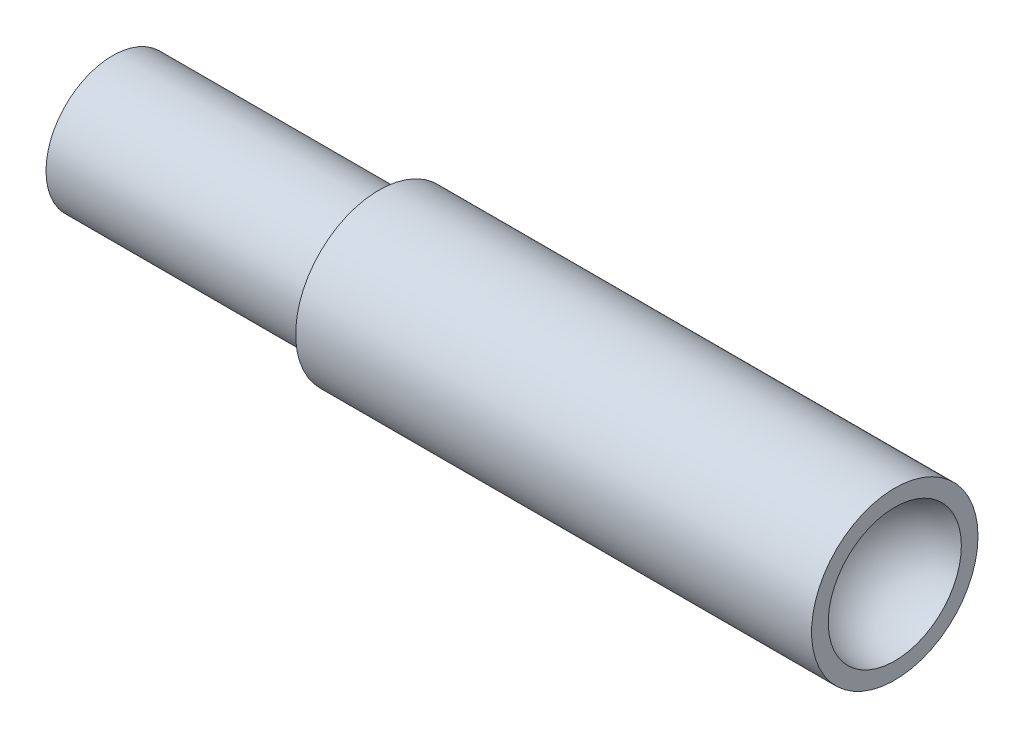
ISO-10303-21;
HEADER;
FILE_DESCRIPTION(('STEP AP214'),'2;1');
FILE_NAME('part.step','',(''),(''),'','','');
FILE_SCHEMA(('AUTOMOTIVE_DESIGN { 1 0 10303 214 1 1 1 1 }'));
ENDSEC;
DATA;
#1=APPLICATION_CONTEXT('core data for automotive mechanical design processes');
#2=APPLICATION_PROTOCOL_DEFINITION('international standard','automotive_design',2000,#1);
#3=PRODUCT_CONTEXT('',#1,'mechanical');
#4=PRODUCT('Part','Part','',(#3));
#5=PRODUCT_RELATED_PRODUCT_CATEGORY('part','',(#4));
#6=PRODUCT_DEFINITION_FORMATION('','',#4);
#7=PRODUCT_DEFINITION_CONTEXT('part definition',#1,'design');
#8=PRODUCT_DEFINITION('design','',#6,#7);
#9=PRODUCT_DEFINITION_SHAPE('','',#8);
#10=(LENGTH_UNIT() NAMED_UNIT(*) SI_UNIT(.MILLI.,.METRE.));
#11=(NAMED_UNIT(*) PLANE_ANGLE_UNIT() SI_UNIT($,.RADIAN.));
#12=(NAMED_UNIT(*) SI_UNIT($,.STERADIAN.) SOLID_ANGLE_UNIT());
#13=UNCERTAINTY_MEASURE_WITH_UNIT(LENGTH_MEASURE(1.E-05),#10,'distance_accuracy_value','');
#14=(GEOMETRIC_REPRESENTATION_CONTEXT(3) GLOBAL_UNCERTAINTY_ASSIGNED_CONTEXT((#13)) GLOBAL_UNIT_ASSIGNED_CONTEXT((#10,
#11,#12)) REPRESENTATION_CONTEXT('',''));
#15=CARTESIAN_POINT('',(0.,0.,0.));
#16=DIRECTION('',(0.,0.,1.));
#17=DIRECTION('',(1.,0.,0.));
#18=AXIS2_PLACEMENT_3D('',#15,#16,#17);
#19=CARTESIAN_POINT('',(-80.,0.,0.));
#20=DIRECTION('',(1.,0.,0.));
#21=DIRECTION('',(0.,0.,-1.));
#22=AXIS2_PLACEMENT_3D('',#19,#20,#21);
#23=CYLINDRICAL_SURFACE('',#22,20.);
#24=CARTESIAN_POINT('',(-80.,0.,0.));
#25=DIRECTION('',(-1.,0.,0.));
#26=DIRECTION('',(0.,0.,1.));
#27=AXIS2_PLACEMENT_3D('',#24,#25,#26);
#28=CIRCLE('',#27,20.);
#29=CARTESIAN_POINT('',(-80.,0.,20.));
#30=VERTEX_POINT('',#29);
#31=EDGE_CURVE('E11',#30,#30,#28,.T.);
#32=ORIENTED_EDGE('',*,*,#31,.F.);
#33=EDGE_LOOP('',(#32));
#34=FACE_BOUND('',#33,.T.);
#35=CARTESIAN_POINT('',(0.,0.,0.));
#36=DIRECTION('',(-1.,0.,0.));
#37=DIRECTION('',(0.,0.,1.));
#38=AXIS2_PLACEMENT_3D('',#35,#36,#37);
#39=CIRCLE('',#38,20.);
#40=CARTESIAN_POINT('',(0.,0.,20.));
#41=VERTEX_POINT('',#40);
#42=EDGE_CURVE('E44',#41,#41,#39,.T.);
#43=ORIENTED_EDGE('',*,*,#42,.T.);
#44=EDGE_LOOP('',(#43));
#45=FACE_BOUND('',#44,.T.);
#46=ADVANCED_FACE('F41',(#34,#45),#23,.T.);
#47=CARTESIAN_POINT('',(-80.,0.,0.));
#48=DIRECTION('',(-1.,0.,0.));
#49=DIRECTION('',(0.,0.,1.));
#50=AXIS2_PLACEMENT_3D('',#47,#48,#49);
#51=PLANE('',#50);
#52=ORIENTED_EDGE('',*,*,#31,.T.);
#53=EDGE_LOOP('',(#52));
#54=FACE_BOUND('',#53,.T.);
#55=ADVANCED_FACE('F56',(#54),#51,.T.);
#56=CARTESIAN_POINT('',(0.,0.,0.));
#57=DIRECTION('',(-1.,0.,0.));
#58=DIRECTION('',(0.,0.,1.));
#59=AXIS2_PLACEMENT_3D('',#56,#57,#58);
#60=PLANE('',#59);
#61=ORIENTED_EDGE('',*,*,#42,.F.);
#62=EDGE_LOOP('',(#61));
#63=FACE_BOUND('',#62,.T.);
#64=ADVANCED_FACE('F54',(#63),#60,.F.);
#65=CLOSED_SHELL('',(#46,#55,#64));
#66=MANIFOLD_SOLID_BREP('B2',#65);
#67=CARTESIAN_POINT('',(155.,0.,0.));
#68=DIRECTION('',(-1.,0.,0.));
#69=DIRECTION('',(0.,0.,1.));
#70=AXIS2_PLACEMENT_3D('',#67,#68,#69);
#71=CYLINDRICAL_SURFACE('',#70,25.);
#72=CARTESIAN_POINT('',(155.,0.,0.));
#73=DIRECTION('',(1.,0.,0.));
#74=DIRECTION('',(0.,0.,-1.));
#75=AXIS2_PLACEMENT_3D('',#72,#73,#74);
#76=CIRCLE('',#75,25.);
#77=CARTESIAN_POINT('',(155.,0.,-25.));
#78=VERTEX_POINT('',#77);
#79=EDGE_CURVE('E40',#78,#78,#76,.T.);
#80=ORIENTED_EDGE('',*,*,#79,.F.);
#81=EDGE_LOOP('',(#80));
#82=FACE_BOUND('',#81,.T.);
#83=CARTESIAN_POINT('',(0.,0.,0.));
#84=DIRECTION('',(1.,0.,0.));
#85=DIRECTION('',(0.,0.,-1.));
#86=AXIS2_PLACEMENT_3D('',#83,#84,#85);
#87=CIRCLE('',#86,25.);
#88=CARTESIAN_POINT('',(0.,0.,-25.));
#89=VERTEX_POINT('',#88);
#90=EDGE_CURVE('E89',#89,#89,#87,.T.);
#91=ORIENTED_EDGE('',*,*,#90,.T.);
#92=EDGE_LOOP('',(#91));
#93=FACE_BOUND('',#92,.T.);
#94=ADVANCED_FACE('F82',(#82,#93),#71,.T.);
#95=CARTESIAN_POINT('',(155.,0.,0.));
#96=DIRECTION('',(1.,0.,0.));
#97=DIRECTION('',(0.,0.,-1.));
#98=AXIS2_PLACEMENT_3D('',#95,#96,#97);
#99=PLANE('',#98);
#100=CARTESIAN_POINT('',(155.,0.,0.));
#101=DIRECTION('',(1.,0.,0.));
#102=DIRECTION('',(0.,0.,-1.));
#103=AXIS2_PLACEMENT_3D('',#100,#101,#102);
#104=CIRCLE('',#103,20.);
#105=CARTESIAN_POINT('',(155.,0.,-20.));
#106=VERTEX_POINT('',#105);
#107=EDGE_CURVE('E85',#106,#106,#104,.T.);
#108=ORIENTED_EDGE('',*,*,#107,.F.);
#109=EDGE_LOOP('',(#108));
#110=FACE_BOUND('',#109,.T.);
#111=ORIENTED_EDGE('',*,*,#79,.T.);
#112=EDGE_LOOP('',(#111));
#113=FACE_BOUND('',#112,.T.);
#114=ADVANCED_FACE('F107',(#110,#113),#99,.T.);
#115=CARTESIAN_POINT('',(0.,0.,0.));
#116=DIRECTION('',(1.,0.,0.));
#117=DIRECTION('',(0.,0.,-1.));
#118=AXIS2_PLACEMENT_3D('',#115,#116,#117);
#119=PLANE('',#118);
#120=CARTESIAN_POINT('',(0.,0.,0.));
#121=DIRECTION('',(-1.,0.,0.));
#122=DIRECTION('',(0.,0.,1.));
#123=AXIS2_PLACEMENT_3D('',#120,#121,#122);
#124=CIRCLE('',#123,20.);
#125=CARTESIAN_POINT('',(0.,0.,20.));
#126=VERTEX_POINT('',#125);
#127=EDGE_CURVE('E95',#126,#126,#124,.T.);
#128=ORIENTED_EDGE('',*,*,#127,.F.);
#129=EDGE_LOOP('',(#128));
#130=FACE_BOUND('',#129,.T.);
#131=ORIENTED_EDGE('',*,*,#90,.F.);
#132=EDGE_LOOP('',(#131));
#133=FACE_BOUND('',#132,.T.);
#134=ADVANCED_FACE('F109',(#130,#133),#119,.F.);
#135=CARTESIAN_POINT('',(155.,0.,0.));
#136=DIRECTION('',(0.,0.,-1.));
#137=DIRECTION('',(0.,-1.,0.));
#138=AXIS2_PLACEMENT_3D('',#135,#136,#137);
#139=SPHERICAL_SURFACE('',#138,20.);
#140=CARTESIAN_POINT('',(155.,0.,0.));
#141=DIRECTION('',(1.,0.,0.));
#142=DIRECTION('',(0.,0.,-1.));
#143=AXIS2_PLACEMENT_3D('',#140,#141,#142);
#144=SPHERICAL_SURFACE('',#143,20.);
#145=ORIENTED_EDGE('',*,*,#107,.T.);
#146=EDGE_LOOP('',(#145));
#147=FACE_BOUND('',#146,.T.);
#148=ADVANCED_FACE('F105',(#147),#144,.F.);
#149=CARTESIAN_POINT('',(100.,0.,0.));
#150=DIRECTION('',(-1.,0.,0.));
#151=DIRECTION('',(0.,0.,1.));
#152=AXIS2_PLACEMENT_3D('',#149,#150,#151);
#153=CYLINDRICAL_SURFACE('',#152,20.);
#154=CARTESIAN_POINT('',(100.,0.,0.));
#155=DIRECTION('',(-1.,0.,0.));
#156=DIRECTION('',(0.,0.,1.));
#157=AXIS2_PLACEMENT_3D('',#154,#155,#156);
#158=CIRCLE('',#157,20.);
#159=CARTESIAN_POINT('',(100.,0.,20.));
#160=VERTEX_POINT('',#159);
#161=EDGE_CURVE('E98',#160,#160,#158,.T.);
#162=ORIENTED_EDGE('',*,*,#161,.F.);
#163=EDGE_LOOP('',(#162));
#164=FACE_BOUND('',#163,.T.);
#165=ORIENTED_EDGE('',*,*,#127,.T.);
#166=EDGE_LOOP('',(#165));
#167=FACE_BOUND('',#166,.T.);
#168=ADVANCED_FACE('F120',(#164,#167),#153,.F.);
#169=CARTESIAN_POINT('',(100.,0.,0.));
#170=DIRECTION('',(-1.,0.,0.));
#171=DIRECTION('',(0.,0.,1.));
#172=AXIS2_PLACEMENT_3D('',#169,#170,#171);
#173=PLANE('',#172);
#174=ORIENTED_EDGE('',*,*,#161,.T.);
#175=EDGE_LOOP('',(#174));
#176=FACE_BOUND('',#175,.T.);
#177=ADVANCED_FACE('F123',(#176),#173,.T.);
#178=CLOSED_SHELL('',(#94,#114,#134,#148,#168,#177));
#179=MANIFOLD_SOLID_BREP('B6',#178);
#180=ADVANCED_BREP_SHAPE_REPRESENTATION('',(#18,#66,#179),#14);
#181=SHAPE_DEFINITION_REPRESENTATION(#9,#180);
ENDSEC;
END-ISO-10303-21;
